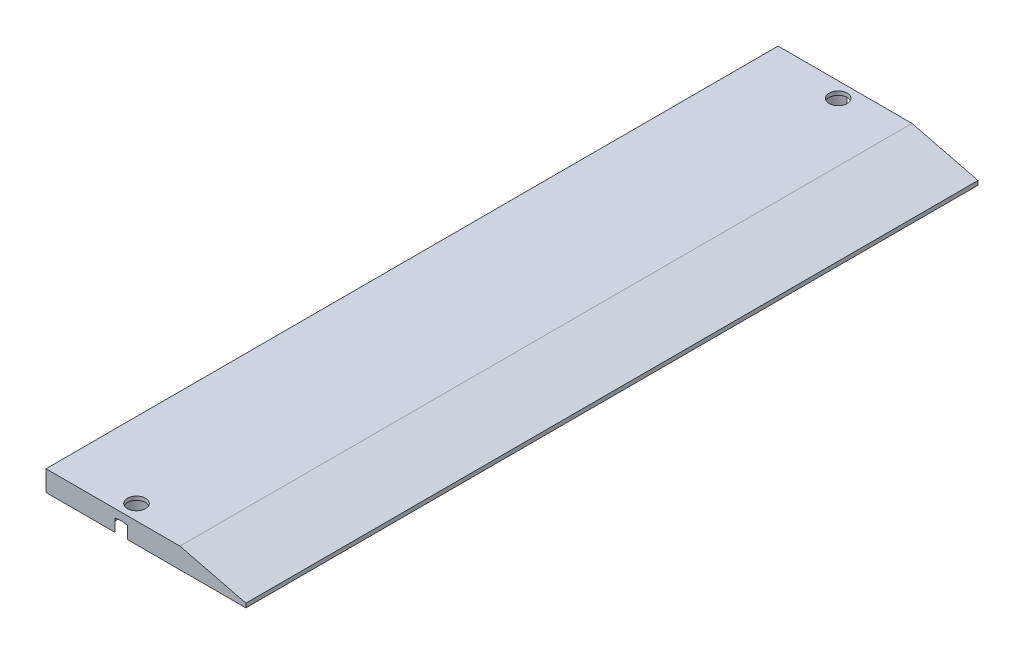
ISO-10303-21;
HEADER;
FILE_DESCRIPTION(('STEP AP214'),'2;1');
FILE_NAME('part.step','',(''),(''),'','','');
FILE_SCHEMA(('AUTOMOTIVE_DESIGN { 1 0 10303 214 1 1 1 1 }'));
ENDSEC;
DATA;
#1=APPLICATION_CONTEXT('core data for automotive mechanical design processes');
#2=APPLICATION_PROTOCOL_DEFINITION('international standard','automotive_design',2000,#1);
#3=PRODUCT_CONTEXT('',#1,'mechanical');
#4=PRODUCT('Part','Part','',(#3));
#5=PRODUCT_RELATED_PRODUCT_CATEGORY('part','',(#4));
#6=PRODUCT_DEFINITION_FORMATION('','',#4);
#7=PRODUCT_DEFINITION_CONTEXT('part definition',#1,'design');
#8=PRODUCT_DEFINITION('design','',#6,#7);
#9=PRODUCT_DEFINITION_SHAPE('','',#8);
#10=(LENGTH_UNIT() NAMED_UNIT(*) SI_UNIT(.MILLI.,.METRE.));
#11=(NAMED_UNIT(*) PLANE_ANGLE_UNIT() SI_UNIT($,.RADIAN.));
#12=(NAMED_UNIT(*) SI_UNIT($,.STERADIAN.) SOLID_ANGLE_UNIT());
#13=UNCERTAINTY_MEASURE_WITH_UNIT(LENGTH_MEASURE(1.E-05),#10,'distance_accuracy_value','');
#14=(GEOMETRIC_REPRESENTATION_CONTEXT(3) GLOBAL_UNCERTAINTY_ASSIGNED_CONTEXT((#13)) GLOBAL_UNIT_ASSIGNED_CONTEXT((#10,
#11,#12)) REPRESENTATION_CONTEXT('',''));
#15=CARTESIAN_POINT('',(0.,0.,0.));
#16=DIRECTION('',(0.,0.,1.));
#17=DIRECTION('',(1.,0.,0.));
#18=AXIS2_PLACEMENT_3D('',#15,#16,#17);
#19=CARTESIAN_POINT('',(24.3,0.,44.5));
#20=DIRECTION('',(0.,1.,0.));
#21=DIRECTION('',(-1.,0.,0.));
#22=AXIS2_PLACEMENT_3D('',#19,#20,#21);
#23=PLANE('',#22);
#24=CARTESIAN_POINT('',(9.15,0.,42.65));
#25=DIRECTION('',(0.,-1.,0.));
#26=DIRECTION('',(0.,0.,-1.));
#27=AXIS2_PLACEMENT_3D('',#24,#25,#26);
#28=CIRCLE('',#27,2.);
#29=CARTESIAN_POINT('',(8.39006579232145,0.,44.5));
#30=VERTEX_POINT('',#29);
#31=CARTESIAN_POINT('',(9.90993420767854,0.,44.5));
#32=VERTEX_POINT('',#31);
#33=EDGE_CURVE('E113',#30,#32,#28,.T.);
#34=ORIENTED_EDGE('',*,*,#33,.F.);
#35=DIRECTION('',(1.,0.,0.));
#36=VECTOR('',#35,1.);
#37=CARTESIAN_POINT('',(24.3,0.,44.5));
#38=LINE('',#37,#36);
#39=CARTESIAN_POINT('',(0.,0.,44.5));
#40=VERTEX_POINT('',#39);
#41=EDGE_CURVE('E118',#40,#30,#38,.T.);
#42=ORIENTED_EDGE('',*,*,#41,.F.);
#43=DIRECTION('',(0.,0.,-1.));
#44=VECTOR('',#43,1.);
#45=CARTESIAN_POINT('',(0.,0.,44.5));
#46=LINE('',#45,#44);
#47=CARTESIAN_POINT('',(0.,0.,-44.5));
#48=VERTEX_POINT('',#47);
#49=EDGE_CURVE('E209',#40,#48,#46,.T.);
#50=ORIENTED_EDGE('',*,*,#49,.T.);
#51=DIRECTION('',(1.,0.,0.));
#52=VECTOR('',#51,1.);
#53=CARTESIAN_POINT('',(24.3,0.,-44.5));
#54=LINE('',#53,#52);
#55=CARTESIAN_POINT('',(8.39006579232145,0.,-44.5));
#56=VERTEX_POINT('',#55);
#57=EDGE_CURVE('E192',#48,#56,#54,.T.);
#58=ORIENTED_EDGE('',*,*,#57,.T.);
#59=CARTESIAN_POINT('',(9.15,0.,-42.65));
#60=DIRECTION('',(0.,-1.,0.));
#61=DIRECTION('',(0.,0.,-1.));
#62=AXIS2_PLACEMENT_3D('',#59,#60,#61);
#63=CIRCLE('',#62,2.);
#64=CARTESIAN_POINT('',(9.90993420767854,0.,-44.5));
#65=VERTEX_POINT('',#64);
#66=EDGE_CURVE('E248',#65,#56,#63,.T.);
#67=ORIENTED_EDGE('',*,*,#66,.F.);
#68=CARTESIAN_POINT('',(24.3,0.,-44.5));
#69=VERTEX_POINT('',#68);
#70=EDGE_CURVE('E227',#65,#69,#54,.T.);
#71=ORIENTED_EDGE('',*,*,#70,.T.);
#72=DIRECTION('',(0.,0.,-1.));
#73=VECTOR('',#72,1.);
#74=CARTESIAN_POINT('',(24.3,0.,44.5));
#75=LINE('',#74,#73);
#76=CARTESIAN_POINT('',(24.3,0.,44.5));
#77=VERTEX_POINT('',#76);
#78=EDGE_CURVE('E155',#77,#69,#75,.T.);
#79=ORIENTED_EDGE('',*,*,#78,.F.);
#80=EDGE_CURVE('E208',#32,#77,#38,.T.);
#81=ORIENTED_EDGE('',*,*,#80,.F.);
#82=EDGE_LOOP('',(#34,#42,#50,#58,#67,#71,#79,#81));
#83=FACE_BOUND('',#82,.T.);
#84=ADVANCED_FACE('F35',(#83),#23,.F.);
#85=CARTESIAN_POINT('',(24.3,0.5,44.5));
#86=DIRECTION('',(-1.,0.,0.));
#87=DIRECTION('',(0.,0.,1.));
#88=AXIS2_PLACEMENT_3D('',#85,#86,#87);
#89=PLANE('',#88);
#90=DIRECTION('',(0.,1.,0.));
#91=VECTOR('',#90,1.);
#92=CARTESIAN_POINT('',(24.3,0.5,-44.5));
#93=LINE('',#92,#91);
#94=CARTESIAN_POINT('',(24.3,0.5,-44.5));
#95=VERTEX_POINT('',#94);
#96=EDGE_CURVE('E183',#69,#95,#93,.T.);
#97=ORIENTED_EDGE('',*,*,#96,.T.);
#98=DIRECTION('',(0.,0.,-1.));
#99=VECTOR('',#98,1.);
#100=CARTESIAN_POINT('',(24.3,0.5,44.5));
#101=LINE('',#100,#99);
#102=CARTESIAN_POINT('',(24.3,0.5,44.5));
#103=VERTEX_POINT('',#102);
#104=EDGE_CURVE('E186',#103,#95,#101,.T.);
#105=ORIENTED_EDGE('',*,*,#104,.F.);
#106=DIRECTION('',(0.,1.,0.));
#107=VECTOR('',#106,1.);
#108=CARTESIAN_POINT('',(24.3,0.5,44.5));
#109=LINE('',#108,#107);
#110=EDGE_CURVE('E223',#77,#103,#109,.T.);
#111=ORIENTED_EDGE('',*,*,#110,.F.);
#112=ORIENTED_EDGE('',*,*,#78,.T.);
#113=EDGE_LOOP('',(#97,#105,#111,#112));
#114=FACE_BOUND('',#113,.T.);
#115=ADVANCED_FACE('F172',(#114),#89,.F.);
#116=CARTESIAN_POINT('',(16.2784381329284,2.5,44.5));
#117=DIRECTION('',(-0.241921895599668,-0.970295726275996,0.));
#118=DIRECTION('',(0.970295726275996,-0.241921895599669,0.));
#119=AXIS2_PLACEMENT_3D('',#116,#117,#118);
#120=PLANE('',#119);
#121=DIRECTION('',(-0.970295726275996,0.241921895599669,0.));
#122=VECTOR('',#121,1.);
#123=CARTESIAN_POINT('',(16.2784381329284,2.5,-44.5));
#124=LINE('',#123,#122);
#125=CARTESIAN_POINT('',(16.2784381329284,2.5,-44.5));
#126=VERTEX_POINT('',#125);
#127=EDGE_CURVE('E191',#95,#126,#124,.T.);
#128=ORIENTED_EDGE('',*,*,#127,.T.);
#129=DIRECTION('',(0.,0.,-1.));
#130=VECTOR('',#129,1.);
#131=CARTESIAN_POINT('',(16.2784381329284,2.5,44.5));
#132=LINE('',#131,#130);
#133=CARTESIAN_POINT('',(16.2784381329284,2.5,44.5));
#134=VERTEX_POINT('',#133);
#135=EDGE_CURVE('E197',#134,#126,#132,.T.);
#136=ORIENTED_EDGE('',*,*,#135,.F.);
#137=DIRECTION('',(-0.970295726275996,0.241921895599669,0.));
#138=VECTOR('',#137,1.);
#139=CARTESIAN_POINT('',(16.2784381329284,2.5,44.5));
#140=LINE('',#139,#138);
#141=EDGE_CURVE('E196',#103,#134,#140,.T.);
#142=ORIENTED_EDGE('',*,*,#141,.F.);
#143=ORIENTED_EDGE('',*,*,#104,.T.);
#144=EDGE_LOOP('',(#128,#136,#142,#143));
#145=FACE_BOUND('',#144,.T.);
#146=ADVANCED_FACE('F169',(#145),#120,.F.);
#147=CARTESIAN_POINT('',(0.,2.5,44.5));
#148=DIRECTION('',(0.,-1.,0.));
#149=DIRECTION('',(1.,0.,0.));
#150=AXIS2_PLACEMENT_3D('',#147,#148,#149);
#151=PLANE('',#150);
#152=CARTESIAN_POINT('',(9.15,2.5,42.65));
#153=DIRECTION('',(0.,-1.,0.));
#154=DIRECTION('',(1.,0.,0.));
#155=AXIS2_PLACEMENT_3D('',#152,#153,#154);
#156=CIRCLE('',#155,1.1);
#157=CARTESIAN_POINT('',(10.25,2.5,42.65));
#158=VERTEX_POINT('',#157);
#159=EDGE_CURVE('E245',#158,#158,#156,.T.);
#160=ORIENTED_EDGE('',*,*,#159,.T.);
#161=EDGE_LOOP('',(#160));
#162=FACE_BOUND('',#161,.T.);
#163=CARTESIAN_POINT('',(9.15,2.5,-42.65));
#164=DIRECTION('',(0.,-1.,0.));
#165=DIRECTION('',(1.,0.,0.));
#166=AXIS2_PLACEMENT_3D('',#163,#164,#165);
#167=CIRCLE('',#166,1.1);
#168=CARTESIAN_POINT('',(10.25,2.5,-42.65));
#169=VERTEX_POINT('',#168);
#170=EDGE_CURVE('E230',#169,#169,#167,.T.);
#171=ORIENTED_EDGE('',*,*,#170,.T.);
#172=EDGE_LOOP('',(#171));
#173=FACE_BOUND('',#172,.T.);
#174=DIRECTION('',(-1.,0.,0.));
#175=VECTOR('',#174,1.);
#176=CARTESIAN_POINT('',(0.,2.5,-44.5));
#177=LINE('',#176,#175);
#178=CARTESIAN_POINT('',(0.,2.5,-44.5));
#179=VERTEX_POINT('',#178);
#180=EDGE_CURVE('E201',#126,#179,#177,.T.);
#181=ORIENTED_EDGE('',*,*,#180,.T.);
#182=DIRECTION('',(0.,0.,-1.));
#183=VECTOR('',#182,1.);
#184=CARTESIAN_POINT('',(0.,2.5,44.5));
#185=LINE('',#184,#183);
#186=CARTESIAN_POINT('',(0.,2.5,44.5));
#187=VERTEX_POINT('',#186);
#188=EDGE_CURVE('E212',#187,#179,#185,.T.);
#189=ORIENTED_EDGE('',*,*,#188,.F.);
#190=DIRECTION('',(-1.,0.,0.));
#191=VECTOR('',#190,1.);
#192=CARTESIAN_POINT('',(0.,2.5,44.5));
#193=LINE('',#192,#191);
#194=EDGE_CURVE('E219',#134,#187,#193,.T.);
#195=ORIENTED_EDGE('',*,*,#194,.F.);
#196=ORIENTED_EDGE('',*,*,#135,.T.);
#197=EDGE_LOOP('',(#181,#189,#195,#196));
#198=FACE_BOUND('',#197,.T.);
#199=ADVANCED_FACE('F165',(#162,#173,#198),#151,.F.);
#200=CARTESIAN_POINT('',(0.,0.,44.5));
#201=DIRECTION('',(1.,0.,0.));
#202=DIRECTION('',(0.,0.,-1.));
#203=AXIS2_PLACEMENT_3D('',#200,#201,#202);
#204=PLANE('',#203);
#205=DIRECTION('',(0.,-1.,0.));
#206=VECTOR('',#205,1.);
#207=CARTESIAN_POINT('',(0.,0.,-44.5));
#208=LINE('',#207,#206);
#209=EDGE_CURVE('E203',#179,#48,#208,.T.);
#210=ORIENTED_EDGE('',*,*,#209,.T.);
#211=ORIENTED_EDGE('',*,*,#49,.F.);
#212=DIRECTION('',(0.,-1.,0.));
#213=VECTOR('',#212,1.);
#214=CARTESIAN_POINT('',(0.,0.,44.5));
#215=LINE('',#214,#213);
#216=EDGE_CURVE('E213',#187,#40,#215,.T.);
#217=ORIENTED_EDGE('',*,*,#216,.F.);
#218=ORIENTED_EDGE('',*,*,#188,.T.);
#219=EDGE_LOOP('',(#210,#211,#217,#218));
#220=FACE_BOUND('',#219,.T.);
#221=ADVANCED_FACE('F162',(#220),#204,.F.);
#222=CARTESIAN_POINT('',(0.,0.,44.5));
#223=DIRECTION('',(0.,0.,-1.));
#224=DIRECTION('',(-1.,0.,0.));
#225=AXIS2_PLACEMENT_3D('',#222,#223,#224);
#226=PLANE('',#225);
#227=CARTESIAN_POINT('',(6.59444238548207,0.806067907899815,44.5));
#228=CARTESIAN_POINT('',(6.6682645925823,0.841987536418596,44.5));
#229=CARTESIAN_POINT('',(6.7422923801491,0.877492518891963,44.5));
#230=CARTESIAN_POINT('',(6.89086107584432,0.947450063041663,44.5));
#231=CARTESIAN_POINT('',(6.96540208392856,0.981902412167576,44.5));
#232=CARTESIAN_POINT('',(7.11552606471736,1.04972316517353,44.5));
#233=CARTESIAN_POINT('',(7.19111261964096,1.08308367608442,44.5));
#234=CARTESIAN_POINT('',(7.34298026279594,1.14817569987937,44.5));
#235=CARTESIAN_POINT('',(7.41926131283884,1.17990730170351,44.5));
#236=CARTESIAN_POINT('',(7.57417174488263,1.24194735074,44.5));
#237=CARTESIAN_POINT('',(7.65281767325495,1.2722149998071,44.5));
#238=CARTESIAN_POINT('',(7.81108731294135,1.33006740940165,44.5));
#239=CARTESIAN_POINT('',(7.89071113507037,1.35765186265018,44.5));
#240=CARTESIAN_POINT('',(8.1308956011947,1.43522494455478,44.5));
#241=CARTESIAN_POINT('',(8.29320139498514,1.48021428056957,44.5));
#242=CARTESIAN_POINT('',(8.54646274004633,1.53353303693847,44.5));
#243=CARTESIAN_POINT('',(8.63586657377305,1.54920451548702,44.5));
#244=CARTESIAN_POINT('',(8.81566336213668,1.57334845963417,44.5));
#245=CARTESIAN_POINT('',(8.90605621485068,1.58182166010068,44.5));
#246=CARTESIAN_POINT('',(9.08622469975676,1.59076121335444,44.5));
#247=CARTESIAN_POINT('',(9.17599578946092,1.59131682336556,44.5));
#248=CARTESIAN_POINT('',(9.35524526981166,1.58460377310746,44.5));
#249=CARTESIAN_POINT('',(9.44472361659146,1.57733398965401,44.5));
#250=CARTESIAN_POINT('',(9.66358111852635,1.5506168392289,44.5));
#251=CARTESIAN_POINT('',(9.7924627475032,1.52711671576831,44.5));
#252=CARTESIAN_POINT('',(10.0474922796653,1.46827150248723,44.5));
#253=CARTESIAN_POINT('',(10.1736373958245,1.43291488962221,44.5));
#254=CARTESIAN_POINT('',(10.3623201051773,1.37311372311389,44.5));
#255=CARTESIAN_POINT('',(10.4258713288542,1.35175855272218,44.5));
#256=CARTESIAN_POINT('',(10.5523277071677,1.30720740948195,44.5));
#257=CARTESIAN_POINT('',(10.6152328562462,1.28401142081179,44.5));
#258=CARTESIAN_POINT('',(10.7404336144126,1.23610775500023,44.5));
#259=CARTESIAN_POINT('',(10.8027294458913,1.21140065523917,44.5));
#260=CARTESIAN_POINT('',(10.9267996975924,1.16072112966394,44.5));
#261=CARTESIAN_POINT('',(10.9885741383714,1.13474875401136,44.5));
#262=CARTESIAN_POINT('',(11.2032967424494,1.04231897698155,44.5));
#263=CARTESIAN_POINT('',(11.355076679947,0.973149165263977,44.5));
#264=CARTESIAN_POINT('',(11.6566631609112,0.830617009352424,44.5));
#265=CARTESIAN_POINT('',(11.8064692838507,0.757253788960367,44.5));
#266=CARTESIAN_POINT('',(12.1047324194077,0.607637131990832,44.5));
#267=CARTESIAN_POINT('',(12.253188622555,0.531382086967987,44.5));
#268=CARTESIAN_POINT('',(12.5490568063834,0.376868105969787,44.5));
#269=CARTESIAN_POINT('',(12.6964687482323,0.298609095968617,44.5));
#270=CARTESIAN_POINT('',(12.9908191140464,0.140472839545878,44.5));
#271=CARTESIAN_POINT('',(13.1377558960653,0.0605925429348834,44.5));
#272=CARTESIAN_POINT('',(13.4310316509055,-0.100259077095215,44.5));
#273=CARTESIAN_POINT('',(13.5773706184478,-0.181230410121667,44.5));
#274=CARTESIAN_POINT('',(14.015596097537,-0.425318798115221,44.5));
#275=CARTESIAN_POINT('',(14.3067962520312,-0.58966722454027,44.5));
#276=CARTESIAN_POINT('',(14.8448337566611,-0.895794407270467,44.5));
#277=CARTESIAN_POINT('',(15.0918296388874,-1.03729569465513,44.5));
#278=CARTESIAN_POINT('',(15.5852500642677,-1.32135089141933,44.5));
#279=CARTESIAN_POINT('',(15.8316745443308,-1.46390491038304,44.5));
#280=CARTESIAN_POINT('',(16.3231603592293,-1.74922120452498,44.5));
#281=CARTESIAN_POINT('',(16.5682233296152,-1.89198066562047,44.5));
#282=CARTESIAN_POINT('',(17.0579895901374,-2.17805114711455,44.5));
#283=CARTESIAN_POINT('',(17.3026929182433,-2.32136210248978,44.5));
#284=CARTESIAN_POINT('',(17.5472801898519,-2.46487006850865,44.5));
#285=B_SPLINE_CURVE_WITH_KNOTS('',3,(#227,#228,#229,#230,#231,#232,#233,#234,#235,#236,#237,
#238,#239,#240,#241,#242,#243,#244,#245,#246,#247,#248,#249,#250,#251,#252,#253,#254,#255,#256,
#257,#258,#259,#260,#261,#262,#263,#264,#265,#266,#267,#268,#269,#270,#271,#272,#273,#274,#275,
#276,#277,#278,#279,#280,#281,#282,#283,#284),.UNSPECIFIED.,.F.,.F.,(4,2,2,2,2,2,2,2,2,2,2,2,2,
2,2,2,2,2,2,2,2,2,2,2,2,2,2,2,4),(0.,0.246295127205871,0.492639662616952,0.740486724665851,
0.988320239588767,1.24107745765782,1.49386358742656,1.99803295705516,2.27009754075422,
2.54213434620322,2.81110194653903,3.08010815713201,3.47233686454723,3.86494788000543,
4.06605621685199,4.2671662823919,4.46819998012517,4.669225714397,5.16950181411883,
5.66988282963293,6.17054636303702,6.67122841754458,7.17296074563737,7.67469749472953,
8.6778124455629,9.53178108106438,10.3858399000068,11.2366770201399,12.0874167220371),.UNSPECIFIED.);
#286=CARTESIAN_POINT('',(8.39006579232146,1.5,44.5));
#287=VERTEX_POINT('',#286);
#288=CARTESIAN_POINT('',(9.90993420767854,1.5,44.5));
#289=VERTEX_POINT('',#288);
#290=EDGE_CURVE('E103',#287,#289,#285,.T.);
#291=ORIENTED_EDGE('',*,*,#290,.T.);
#292=DIRECTION('',(0.,-1.,0.));
#293=VECTOR('',#292,1.);
#294=CARTESIAN_POINT('',(9.90993420767854,0.,44.5));
#295=LINE('',#294,#293);
#296=EDGE_CURVE('E11',#289,#32,#295,.T.);
#297=ORIENTED_EDGE('',*,*,#296,.T.);
#298=ORIENTED_EDGE('',*,*,#80,.T.);
#299=ORIENTED_EDGE('',*,*,#110,.T.);
#300=ORIENTED_EDGE('',*,*,#141,.T.);
#301=ORIENTED_EDGE('',*,*,#194,.T.);
#302=ORIENTED_EDGE('',*,*,#216,.T.);
#303=ORIENTED_EDGE('',*,*,#41,.T.);
#304=DIRECTION('',(0.,-1.,0.));
#305=VECTOR('',#304,1.);
#306=CARTESIAN_POINT('',(8.39006579232146,0.,44.5));
#307=LINE('',#306,#305);
#308=EDGE_CURVE('E42',#30,#287,#307,.F.);
#309=ORIENTED_EDGE('',*,*,#308,.T.);
#310=EDGE_LOOP('',(#291,#297,#298,#299,#300,#301,#302,#303,#309));
#311=FACE_BOUND('',#310,.T.);
#312=ADVANCED_FACE('F116',(#311),#226,.F.);
#313=CARTESIAN_POINT('',(0.,0.,-44.5));
#314=DIRECTION('',(0.,0.,-1.));
#315=DIRECTION('',(-1.,0.,0.));
#316=AXIS2_PLACEMENT_3D('',#313,#314,#315);
#317=PLANE('',#316);
#318=DIRECTION('',(0.,-1.,0.));
#319=VECTOR('',#318,1.);
#320=CARTESIAN_POINT('',(9.90993420767854,0.,-44.5));
#321=LINE('',#320,#319);
#322=CARTESIAN_POINT('',(9.90993420767854,1.5,-44.5));
#323=VERTEX_POINT('',#322);
#324=EDGE_CURVE('E107',#323,#65,#321,.T.);
#325=ORIENTED_EDGE('',*,*,#324,.F.);
#326=CARTESIAN_POINT('',(6.59444238548207,0.806067907899815,-44.5));
#327=CARTESIAN_POINT('',(6.6682645925823,0.841987536418596,-44.5));
#328=CARTESIAN_POINT('',(6.7422923801491,0.877492518891963,-44.5));
#329=CARTESIAN_POINT('',(6.89086107584432,0.947450063041663,-44.5));
#330=CARTESIAN_POINT('',(6.96540208392856,0.981902412167576,-44.5));
#331=CARTESIAN_POINT('',(7.11552606471736,1.04972316517353,-44.5));
#332=CARTESIAN_POINT('',(7.19111261964096,1.08308367608442,-44.5));
#333=CARTESIAN_POINT('',(7.34298026279594,1.14817569987937,-44.5));
#334=CARTESIAN_POINT('',(7.41926131283884,1.17990730170351,-44.5));
#335=CARTESIAN_POINT('',(7.57417174488263,1.24194735074,-44.5));
#336=CARTESIAN_POINT('',(7.65281767325495,1.2722149998071,-44.5));
#337=CARTESIAN_POINT('',(7.81108731294135,1.33006740940165,-44.5));
#338=CARTESIAN_POINT('',(7.89071113507037,1.35765186265018,-44.5));
#339=CARTESIAN_POINT('',(8.1308956011947,1.43522494455478,-44.5));
#340=CARTESIAN_POINT('',(8.29320139498514,1.48021428056957,-44.5));
#341=CARTESIAN_POINT('',(8.54646274004633,1.53353303693847,-44.5));
#342=CARTESIAN_POINT('',(8.63586657377305,1.54920451548702,-44.5));
#343=CARTESIAN_POINT('',(8.81566336213668,1.57334845963417,-44.5));
#344=CARTESIAN_POINT('',(8.90605621485068,1.58182166010068,-44.5));
#345=CARTESIAN_POINT('',(9.08622469975676,1.59076121335444,-44.5));
#346=CARTESIAN_POINT('',(9.17599578946092,1.59131682336556,-44.5));
#347=CARTESIAN_POINT('',(9.35524526981166,1.58460377310746,-44.5));
#348=CARTESIAN_POINT('',(9.44472361659146,1.57733398965401,-44.5));
#349=CARTESIAN_POINT('',(9.66358111852635,1.5506168392289,-44.5));
#350=CARTESIAN_POINT('',(9.7924627475032,1.52711671576831,-44.5));
#351=CARTESIAN_POINT('',(10.0474922796653,1.46827150248723,-44.5));
#352=CARTESIAN_POINT('',(10.1736373958245,1.43291488962221,-44.5));
#353=CARTESIAN_POINT('',(10.3623201051773,1.37311372311389,-44.5));
#354=CARTESIAN_POINT('',(10.4258713288542,1.35175855272218,-44.5));
#355=CARTESIAN_POINT('',(10.5523277071677,1.30720740948195,-44.5));
#356=CARTESIAN_POINT('',(10.6152328562462,1.28401142081179,-44.5));
#357=CARTESIAN_POINT('',(10.7404336144126,1.23610775500023,-44.5));
#358=CARTESIAN_POINT('',(10.8027294458913,1.21140065523917,-44.5));
#359=CARTESIAN_POINT('',(10.9267996975924,1.16072112966394,-44.5));
#360=CARTESIAN_POINT('',(10.9885741383714,1.13474875401136,-44.5));
#361=CARTESIAN_POINT('',(11.2032967424494,1.04231897698155,-44.5));
#362=CARTESIAN_POINT('',(11.355076679947,0.973149165263977,-44.5));
#363=CARTESIAN_POINT('',(11.6566631609112,0.830617009352424,-44.5));
#364=CARTESIAN_POINT('',(11.8064692838507,0.757253788960367,-44.5));
#365=CARTESIAN_POINT('',(12.1047324194077,0.607637131990832,-44.5));
#366=CARTESIAN_POINT('',(12.253188622555,0.531382086967987,-44.5));
#367=CARTESIAN_POINT('',(12.5490568063834,0.376868105969787,-44.5));
#368=CARTESIAN_POINT('',(12.6964687482323,0.298609095968617,-44.5));
#369=CARTESIAN_POINT('',(12.9908191140464,0.140472839545878,-44.5));
#370=CARTESIAN_POINT('',(13.1377558960653,0.0605925429348834,-44.5));
#371=CARTESIAN_POINT('',(13.4310316509055,-0.100259077095215,-44.5));
#372=CARTESIAN_POINT('',(13.5773706184478,-0.181230410121667,-44.5));
#373=CARTESIAN_POINT('',(14.015596097537,-0.425318798115221,-44.5));
#374=CARTESIAN_POINT('',(14.3067962520312,-0.58966722454027,-44.5));
#375=CARTESIAN_POINT('',(14.8448337566611,-0.895794407270467,-44.5));
#376=CARTESIAN_POINT('',(15.0918296388874,-1.03729569465513,-44.5));
#377=CARTESIAN_POINT('',(15.5852500642677,-1.32135089141933,-44.5));
#378=CARTESIAN_POINT('',(15.8316745443308,-1.46390491038304,-44.5));
#379=CARTESIAN_POINT('',(16.3231603592293,-1.74922120452498,-44.5));
#380=CARTESIAN_POINT('',(16.5682233296152,-1.89198066562047,-44.5));
#381=CARTESIAN_POINT('',(17.0579895901374,-2.17805114711455,-44.5));
#382=CARTESIAN_POINT('',(17.3026929182433,-2.32136210248978,-44.5));
#383=CARTESIAN_POINT('',(17.5472801898519,-2.46487006850865,-44.5));
#384=B_SPLINE_CURVE_WITH_KNOTS('',3,(#326,#327,#328,#329,#330,#331,#332,#333,#334,#335,#336,
#337,#338,#339,#340,#341,#342,#343,#344,#345,#346,#347,#348,#349,#350,#351,#352,#353,#354,#355,
#356,#357,#358,#359,#360,#361,#362,#363,#364,#365,#366,#367,#368,#369,#370,#371,#372,#373,#374,
#375,#376,#377,#378,#379,#380,#381,#382,#383),.UNSPECIFIED.,.F.,.F.,(4,2,2,2,2,2,2,2,2,2,2,2,2,
2,2,2,2,2,2,2,2,2,2,2,2,2,2,2,4),(0.,0.246295127205871,0.492639662616952,0.740486724665851,
0.988320239588767,1.24107745765782,1.49386358742656,1.99803295705516,2.27009754075422,
2.54213434620322,2.81110194653903,3.08010815713201,3.47233686454723,3.86494788000543,
4.06605621685199,4.2671662823919,4.46819998012517,4.669225714397,5.16950181411883,
5.66988282963293,6.17054636303702,6.67122841754458,7.17296074563737,7.67469749472953,
8.6778124455629,9.53178108106438,10.3858399000068,11.2366770201399,12.0874167220371),.UNSPECIFIED.);
#385=CARTESIAN_POINT('',(8.39006579232146,1.5,-44.5));
#386=VERTEX_POINT('',#385);
#387=EDGE_CURVE('E148',#386,#323,#384,.T.);
#388=ORIENTED_EDGE('',*,*,#387,.F.);
#389=DIRECTION('',(0.,-1.,0.));
#390=VECTOR('',#389,1.);
#391=CARTESIAN_POINT('',(8.39006579232146,0.,-44.5));
#392=LINE('',#391,#390);
#393=EDGE_CURVE('E154',#56,#386,#392,.F.);
#394=ORIENTED_EDGE('',*,*,#393,.F.);
#395=ORIENTED_EDGE('',*,*,#57,.F.);
#396=ORIENTED_EDGE('',*,*,#209,.F.);
#397=ORIENTED_EDGE('',*,*,#180,.F.);
#398=ORIENTED_EDGE('',*,*,#127,.F.);
#399=ORIENTED_EDGE('',*,*,#96,.F.);
#400=ORIENTED_EDGE('',*,*,#70,.F.);
#401=EDGE_LOOP('',(#325,#388,#394,#395,#396,#397,#398,#399,#400));
#402=FACE_BOUND('',#401,.T.);
#403=ADVANCED_FACE('F157',(#402),#317,.T.);
#404=CARTESIAN_POINT('',(9.15,0.,-42.65));
#405=DIRECTION('',(0.,-1.,0.));
#406=DIRECTION('',(0.,0.,-1.));
#407=AXIS2_PLACEMENT_3D('',#404,#405,#406);
#408=CYLINDRICAL_SURFACE('',#407,1.1);
#409=ORIENTED_EDGE('',*,*,#170,.F.);
#410=EDGE_LOOP('',(#409));
#411=FACE_BOUND('',#410,.T.);
#412=CARTESIAN_POINT('',(9.15,2.0407745571248,-42.65));
#413=DIRECTION('',(0.,-1.,0.));
#414=DIRECTION('',(0.,0.,-1.));
#415=AXIS2_PLACEMENT_3D('',#412,#413,#414);
#416=CIRCLE('',#415,1.1);
#417=CARTESIAN_POINT('',(9.15,2.0407745571248,-43.75));
#418=VERTEX_POINT('',#417);
#419=EDGE_CURVE('E232',#418,#418,#416,.T.);
#420=ORIENTED_EDGE('',*,*,#419,.T.);
#421=EDGE_LOOP('',(#420));
#422=FACE_BOUND('',#421,.T.);
#423=ADVANCED_FACE('F146',(#411,#422),#408,.F.);
#424=CARTESIAN_POINT('',(9.15,1.5,-42.65));
#425=DIRECTION('',(0.,-1.,0.));
#426=DIRECTION('',(0.,0.,-1.));
#427=AXIS2_PLACEMENT_3D('',#424,#425,#426);
#428=CONICAL_SURFACE('',#427,2.,1.02974425867666);
#429=ORIENTED_EDGE('',*,*,#387,.T.);
#430=CARTESIAN_POINT('',(9.15,1.5,-42.65));
#431=DIRECTION('',(0.,-1.,0.));
#432=DIRECTION('',(0.,0.,-1.));
#433=AXIS2_PLACEMENT_3D('',#430,#431,#432);
#434=CIRCLE('',#433,2.);
#435=EDGE_CURVE('E55',#323,#386,#434,.T.);
#436=ORIENTED_EDGE('',*,*,#435,.T.);
#437=EDGE_LOOP('',(#429,#436));
#438=FACE_BOUND('',#437,.T.);
#439=ORIENTED_EDGE('',*,*,#419,.F.);
#440=EDGE_LOOP('',(#439));
#441=FACE_BOUND('',#440,.T.);
#442=ADVANCED_FACE('F142',(#438,#441),#428,.F.);
#443=CARTESIAN_POINT('',(9.15,0.,-42.65));
#444=DIRECTION('',(0.,-1.,0.));
#445=DIRECTION('',(0.,0.,-1.));
#446=AXIS2_PLACEMENT_3D('',#443,#444,#445);
#447=CYLINDRICAL_SURFACE('',#446,2.);
#448=ORIENTED_EDGE('',*,*,#324,.T.);
#449=ORIENTED_EDGE('',*,*,#66,.T.);
#450=ORIENTED_EDGE('',*,*,#393,.T.);
#451=ORIENTED_EDGE('',*,*,#435,.F.);
#452=EDGE_LOOP('',(#448,#449,#450,#451));
#453=FACE_BOUND('',#452,.T.);
#454=ADVANCED_FACE('F139',(#453),#447,.F.);
#455=CARTESIAN_POINT('',(9.15,0.,42.65));
#456=DIRECTION('',(0.,-1.,0.));
#457=DIRECTION('',(0.,0.,-1.));
#458=AXIS2_PLACEMENT_3D('',#455,#456,#457);
#459=CYLINDRICAL_SURFACE('',#458,2.);
#460=CARTESIAN_POINT('',(9.15,1.5,42.65));
#461=DIRECTION('',(0.,-1.,0.));
#462=DIRECTION('',(0.,0.,-1.));
#463=AXIS2_PLACEMENT_3D('',#460,#461,#462);
#464=CIRCLE('',#463,2.);
#465=EDGE_CURVE('E48',#287,#289,#464,.T.);
#466=ORIENTED_EDGE('',*,*,#465,.F.);
#467=ORIENTED_EDGE('',*,*,#308,.F.);
#468=ORIENTED_EDGE('',*,*,#33,.T.);
#469=ORIENTED_EDGE('',*,*,#296,.F.);
#470=EDGE_LOOP('',(#466,#467,#468,#469));
#471=FACE_BOUND('',#470,.T.);
#472=ADVANCED_FACE('F110',(#471),#459,.F.);
#473=CARTESIAN_POINT('',(9.15,1.5,42.65));
#474=DIRECTION('',(0.,-1.,0.));
#475=DIRECTION('',(0.,0.,-1.));
#476=AXIS2_PLACEMENT_3D('',#473,#474,#475);
#477=CONICAL_SURFACE('',#476,2.,1.02974425867666);
#478=CARTESIAN_POINT('',(9.15,2.0407745571248,42.65));
#479=DIRECTION('',(0.,-1.,0.));
#480=DIRECTION('',(0.,0.,-1.));
#481=AXIS2_PLACEMENT_3D('',#478,#479,#480);
#482=CIRCLE('',#481,1.1);
#483=CARTESIAN_POINT('',(9.15,2.0407745571248,41.55));
#484=VERTEX_POINT('',#483);
#485=EDGE_CURVE('E112',#484,#484,#482,.T.);
#486=ORIENTED_EDGE('',*,*,#485,.F.);
#487=EDGE_LOOP('',(#486));
#488=FACE_BOUND('',#487,.T.);
#489=ORIENTED_EDGE('',*,*,#465,.T.);
#490=ORIENTED_EDGE('',*,*,#290,.F.);
#491=EDGE_LOOP('',(#489,#490));
#492=FACE_BOUND('',#491,.T.);
#493=ADVANCED_FACE('F104',(#488,#492),#477,.F.);
#494=CARTESIAN_POINT('',(9.15,0.,42.65));
#495=DIRECTION('',(0.,-1.,0.));
#496=DIRECTION('',(0.,0.,-1.));
#497=AXIS2_PLACEMENT_3D('',#494,#495,#496);
#498=CYLINDRICAL_SURFACE('',#497,1.1);
#499=ORIENTED_EDGE('',*,*,#159,.F.);
#500=EDGE_LOOP('',(#499));
#501=FACE_BOUND('',#500,.T.);
#502=ORIENTED_EDGE('',*,*,#485,.T.);
#503=EDGE_LOOP('',(#502));
#504=FACE_BOUND('',#503,.T.);
#505=ADVANCED_FACE('F134',(#501,#504),#498,.F.);
#506=CLOSED_SHELL('',(#84,#115,#146,#199,#221,#312,#403,#423,#442,#454,#472,#493,#505));
#507=MANIFOLD_SOLID_BREP('B2',#506);
#508=ADVANCED_BREP_SHAPE_REPRESENTATION('',(#18,#507),#14);
#509=SHAPE_DEFINITION_REPRESENTATION(#9,#508);
ENDSEC;
END-ISO-10303-21;
